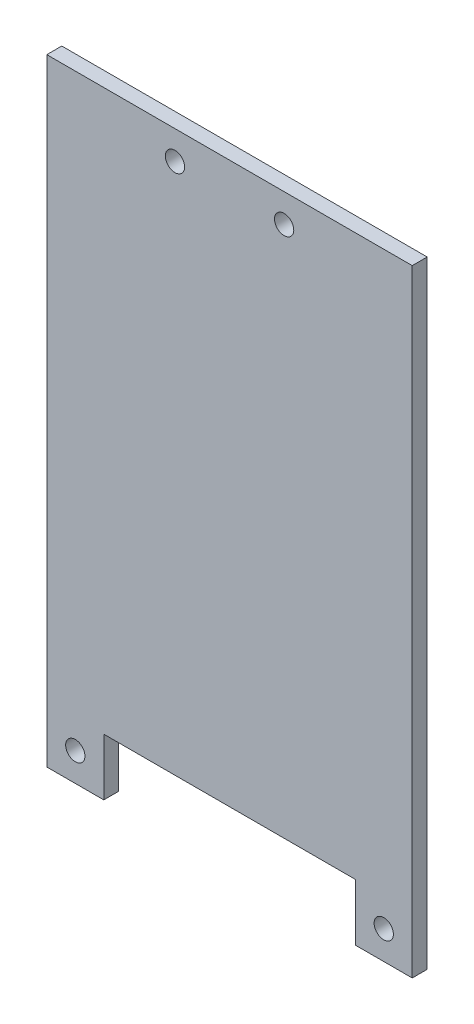
ISO-10303-21;
HEADER;
FILE_DESCRIPTION(('STEP AP214'),'2;1');
FILE_NAME('part.step','',(''),(''),'','','');
FILE_SCHEMA(('AUTOMOTIVE_DESIGN { 1 0 10303 214 1 1 1 1 }'));
ENDSEC;
DATA;
#1=APPLICATION_CONTEXT('core data for automotive mechanical design processes');
#2=APPLICATION_PROTOCOL_DEFINITION('international standard','automotive_design',2000,#1);
#3=PRODUCT_CONTEXT('',#1,'mechanical');
#4=PRODUCT('Part','Part','',(#3));
#5=PRODUCT_RELATED_PRODUCT_CATEGORY('part','',(#4));
#6=PRODUCT_DEFINITION_FORMATION('','',#4);
#7=PRODUCT_DEFINITION_CONTEXT('part definition',#1,'design');
#8=PRODUCT_DEFINITION('design','',#6,#7);
#9=PRODUCT_DEFINITION_SHAPE('','',#8);
#10=(LENGTH_UNIT() NAMED_UNIT(*) SI_UNIT(.MILLI.,.METRE.));
#11=(NAMED_UNIT(*) PLANE_ANGLE_UNIT() SI_UNIT($,.RADIAN.));
#12=(NAMED_UNIT(*) SI_UNIT($,.STERADIAN.) SOLID_ANGLE_UNIT());
#13=UNCERTAINTY_MEASURE_WITH_UNIT(LENGTH_MEASURE(1.E-05),#10,'distance_accuracy_value','');
#14=(GEOMETRIC_REPRESENTATION_CONTEXT(3) GLOBAL_UNCERTAINTY_ASSIGNED_CONTEXT((#13)) GLOBAL_UNIT_ASSIGNED_CONTEXT((#10,
#11,#12)) REPRESENTATION_CONTEXT('',''));
#15=CARTESIAN_POINT('',(0.,0.,0.));
#16=DIRECTION('',(0.,0.,1.));
#17=DIRECTION('',(1.,0.,0.));
#18=AXIS2_PLACEMENT_3D('',#15,#16,#17);
#19=CARTESIAN_POINT('',(6.10108,1.76276,1.5748));
#20=DIRECTION('',(0.,-1.,0.));
#21=DIRECTION('',(0.,0.,-1.));
#22=AXIS2_PLACEMENT_3D('',#19,#20,#21);
#23=PLANE('',#22);
#24=DIRECTION('',(-1.,0.,0.));
#25=VECTOR('',#24,1.);
#26=CARTESIAN_POINT('',(6.10108,1.76276,0.));
#27=LINE('',#26,#25);
#28=CARTESIAN_POINT('',(6.10108,1.76276,0.));
#29=VERTEX_POINT('',#28);
#30=CARTESIAN_POINT('',(0.1016,1.76276,0.));
#31=VERTEX_POINT('',#30);
#32=EDGE_CURVE('E142',#29,#31,#27,.T.);
#33=ORIENTED_EDGE('',*,*,#32,.F.);
#34=DIRECTION('',(0.,0.,-1.));
#35=VECTOR('',#34,1.);
#36=CARTESIAN_POINT('',(6.10108,1.76276,1.5748));
#37=LINE('',#36,#35);
#38=CARTESIAN_POINT('',(6.10108,1.76276,1.5748));
#39=VERTEX_POINT('',#38);
#40=EDGE_CURVE('E13',#39,#29,#37,.T.);
#41=ORIENTED_EDGE('',*,*,#40,.F.);
#42=DIRECTION('',(-1.,0.,0.));
#43=VECTOR('',#42,1.);
#44=CARTESIAN_POINT('',(6.10108,1.76276,1.5748));
#45=LINE('',#44,#43);
#46=CARTESIAN_POINT('',(0.1016,1.76276,1.5748));
#47=VERTEX_POINT('',#46);
#48=EDGE_CURVE('E163',#39,#47,#45,.T.);
#49=ORIENTED_EDGE('',*,*,#48,.T.);
#50=DIRECTION('',(0.,0.,-1.));
#51=VECTOR('',#50,1.);
#52=CARTESIAN_POINT('',(0.1016,1.76276,1.5748));
#53=LINE('',#52,#51);
#54=EDGE_CURVE('E49',#47,#31,#53,.T.);
#55=ORIENTED_EDGE('',*,*,#54,.T.);
#56=EDGE_LOOP('',(#33,#41,#49,#55));
#57=FACE_BOUND('',#56,.T.);
#58=ADVANCED_FACE('F46',(#57),#23,.T.);
#59=CARTESIAN_POINT('',(6.10108,7.76224,1.5748));
#60=DIRECTION('',(1.,0.,0.));
#61=DIRECTION('',(0.,0.,-1.));
#62=AXIS2_PLACEMENT_3D('',#59,#60,#61);
#63=PLANE('',#62);
#64=DIRECTION('',(0.,-1.,0.));
#65=VECTOR('',#64,1.);
#66=CARTESIAN_POINT('',(6.10108,7.76224,0.));
#67=LINE('',#66,#65);
#68=CARTESIAN_POINT('',(6.10108,7.76224,0.));
#69=VERTEX_POINT('',#68);
#70=EDGE_CURVE('E161',#69,#29,#67,.T.);
#71=ORIENTED_EDGE('',*,*,#70,.F.);
#72=DIRECTION('',(0.,0.,-1.));
#73=VECTOR('',#72,1.);
#74=CARTESIAN_POINT('',(6.10108,7.76224,1.5748));
#75=LINE('',#74,#73);
#76=CARTESIAN_POINT('',(6.10108,7.76224,1.5748));
#77=VERTEX_POINT('',#76);
#78=EDGE_CURVE('E55',#77,#69,#75,.T.);
#79=ORIENTED_EDGE('',*,*,#78,.F.);
#80=DIRECTION('',(0.,-1.,0.));
#81=VECTOR('',#80,1.);
#82=CARTESIAN_POINT('',(6.10108,7.76224,1.5748));
#83=LINE('',#82,#81);
#84=EDGE_CURVE('E122',#77,#39,#83,.T.);
#85=ORIENTED_EDGE('',*,*,#84,.T.);
#86=ORIENTED_EDGE('',*,*,#40,.T.);
#87=EDGE_LOOP('',(#71,#79,#85,#86));
#88=FACE_BOUND('',#87,.T.);
#89=ADVANCED_FACE('F176',(#88),#63,.T.);
#90=CARTESIAN_POINT('',(6.10108,7.76224,1.5748));
#91=DIRECTION('',(0.,1.,0.));
#92=DIRECTION('',(0.,0.,1.));
#93=AXIS2_PLACEMENT_3D('',#90,#91,#92);
#94=PLANE('',#93);
#95=DIRECTION('',(1.,0.,0.));
#96=VECTOR('',#95,1.);
#97=CARTESIAN_POINT('',(6.10108,7.76224,0.));
#98=LINE('',#97,#96);
#99=CARTESIAN_POINT('',(32.6009,7.76224,0.));
#100=VERTEX_POINT('',#99);
#101=EDGE_CURVE('E127',#69,#100,#98,.T.);
#102=ORIENTED_EDGE('',*,*,#101,.T.);
#103=DIRECTION('',(0.,0.,-1.));
#104=VECTOR('',#103,1.);
#105=CARTESIAN_POINT('',(32.6009,7.76224,1.5748));
#106=LINE('',#105,#104);
#107=CARTESIAN_POINT('',(32.6009,7.76224,1.5748));
#108=VERTEX_POINT('',#107);
#109=EDGE_CURVE('E125',#108,#100,#106,.T.);
#110=ORIENTED_EDGE('',*,*,#109,.F.);
#111=DIRECTION('',(1.,0.,0.));
#112=VECTOR('',#111,1.);
#113=CARTESIAN_POINT('',(6.10108,7.76224,1.5748));
#114=LINE('',#113,#112);
#115=EDGE_CURVE('E116',#77,#108,#114,.T.);
#116=ORIENTED_EDGE('',*,*,#115,.F.);
#117=ORIENTED_EDGE('',*,*,#78,.T.);
#118=EDGE_LOOP('',(#102,#110,#116,#117));
#119=FACE_BOUND('',#118,.T.);
#120=ADVANCED_FACE('F126',(#119),#94,.F.);
#121=CARTESIAN_POINT('',(32.6009,7.76224,1.5748));
#122=DIRECTION('',(1.,0.,0.));
#123=DIRECTION('',(0.,0.,-1.));
#124=AXIS2_PLACEMENT_3D('',#121,#122,#123);
#125=PLANE('',#124);
#126=DIRECTION('',(0.,-1.,0.));
#127=VECTOR('',#126,1.);
#128=CARTESIAN_POINT('',(32.6009,7.76224,0.));
#129=LINE('',#128,#127);
#130=CARTESIAN_POINT('',(32.6009,1.76276,0.));
#131=VERTEX_POINT('',#130);
#132=EDGE_CURVE('E158',#100,#131,#129,.T.);
#133=ORIENTED_EDGE('',*,*,#132,.T.);
#134=DIRECTION('',(0.,0.,-1.));
#135=VECTOR('',#134,1.);
#136=CARTESIAN_POINT('',(32.6009,1.76276,1.5748));
#137=LINE('',#136,#135);
#138=CARTESIAN_POINT('',(32.6009,1.76276,1.5748));
#139=VERTEX_POINT('',#138);
#140=EDGE_CURVE('E130',#139,#131,#137,.T.);
#141=ORIENTED_EDGE('',*,*,#140,.F.);
#142=DIRECTION('',(0.,-1.,0.));
#143=VECTOR('',#142,1.);
#144=CARTESIAN_POINT('',(32.6009,7.76224,1.5748));
#145=LINE('',#144,#143);
#146=EDGE_CURVE('E120',#108,#139,#145,.T.);
#147=ORIENTED_EDGE('',*,*,#146,.F.);
#148=ORIENTED_EDGE('',*,*,#109,.T.);
#149=EDGE_LOOP('',(#133,#141,#147,#148));
#150=FACE_BOUND('',#149,.T.);
#151=ADVANCED_FACE('F132',(#150),#125,.F.);
#152=CARTESIAN_POINT('',(32.6009,1.76276,1.5748));
#153=DIRECTION('',(0.,1.,0.));
#154=DIRECTION('',(0.,0.,1.));
#155=AXIS2_PLACEMENT_3D('',#152,#153,#154);
#156=PLANE('',#155);
#157=DIRECTION('',(1.,0.,0.));
#158=VECTOR('',#157,1.);
#159=CARTESIAN_POINT('',(32.6009,1.76276,0.));
#160=LINE('',#159,#158);
#161=CARTESIAN_POINT('',(38.60038,1.76276,0.));
#162=VERTEX_POINT('',#161);
#163=EDGE_CURVE('E155',#131,#162,#160,.T.);
#164=ORIENTED_EDGE('',*,*,#163,.T.);
#165=DIRECTION('',(0.,0.,-1.));
#166=VECTOR('',#165,1.);
#167=CARTESIAN_POINT('',(38.60038,1.76276,1.5748));
#168=LINE('',#167,#166);
#169=CARTESIAN_POINT('',(38.60038,1.76276,1.5748));
#170=VERTEX_POINT('',#169);
#171=EDGE_CURVE('E167',#170,#162,#168,.T.);
#172=ORIENTED_EDGE('',*,*,#171,.F.);
#173=DIRECTION('',(1.,0.,0.));
#174=VECTOR('',#173,1.);
#175=CARTESIAN_POINT('',(32.6009,1.76276,1.5748));
#176=LINE('',#175,#174);
#177=EDGE_CURVE('E135',#139,#170,#176,.T.);
#178=ORIENTED_EDGE('',*,*,#177,.F.);
#179=ORIENTED_EDGE('',*,*,#140,.T.);
#180=EDGE_LOOP('',(#164,#172,#178,#179));
#181=FACE_BOUND('',#180,.T.);
#182=ADVANCED_FACE('F189',(#181),#156,.F.);
#183=CARTESIAN_POINT('',(38.60038,66.76136,1.5748));
#184=DIRECTION('',(1.,0.,0.));
#185=DIRECTION('',(0.,0.,-1.));
#186=AXIS2_PLACEMENT_3D('',#183,#184,#185);
#187=PLANE('',#186);
#188=DIRECTION('',(0.,-1.,0.));
#189=VECTOR('',#188,1.);
#190=CARTESIAN_POINT('',(38.60038,66.76136,0.));
#191=LINE('',#190,#189);
#192=CARTESIAN_POINT('',(38.60038,66.76136,0.));
#193=VERTEX_POINT('',#192);
#194=EDGE_CURVE('E152',#193,#162,#191,.T.);
#195=ORIENTED_EDGE('',*,*,#194,.F.);
#196=DIRECTION('',(0.,0.,-1.));
#197=VECTOR('',#196,1.);
#198=CARTESIAN_POINT('',(38.60038,66.76136,1.5748));
#199=LINE('',#198,#197);
#200=CARTESIAN_POINT('',(38.60038,66.76136,1.5748));
#201=VERTEX_POINT('',#200);
#202=EDGE_CURVE('E169',#201,#193,#199,.T.);
#203=ORIENTED_EDGE('',*,*,#202,.F.);
#204=DIRECTION('',(0.,-1.,0.));
#205=VECTOR('',#204,1.);
#206=CARTESIAN_POINT('',(38.60038,66.76136,1.5748));
#207=LINE('',#206,#205);
#208=EDGE_CURVE('E137',#201,#170,#207,.T.);
#209=ORIENTED_EDGE('',*,*,#208,.T.);
#210=ORIENTED_EDGE('',*,*,#171,.T.);
#211=EDGE_LOOP('',(#195,#203,#209,#210));
#212=FACE_BOUND('',#211,.T.);
#213=ADVANCED_FACE('F192',(#212),#187,.T.);
#214=CARTESIAN_POINT('',(38.60038,66.76136,1.5748));
#215=DIRECTION('',(0.,-1.,0.));
#216=DIRECTION('',(0.,0.,-1.));
#217=AXIS2_PLACEMENT_3D('',#214,#215,#216);
#218=PLANE('',#217);
#219=DIRECTION('',(-1.,0.,0.));
#220=VECTOR('',#219,1.);
#221=CARTESIAN_POINT('',(38.60038,66.76136,0.));
#222=LINE('',#221,#220);
#223=CARTESIAN_POINT('',(0.1016,66.76136,0.));
#224=VERTEX_POINT('',#223);
#225=EDGE_CURVE('E149',#193,#224,#222,.T.);
#226=ORIENTED_EDGE('',*,*,#225,.T.);
#227=DIRECTION('',(0.,0.,-1.));
#228=VECTOR('',#227,1.);
#229=CARTESIAN_POINT('',(0.1016,66.76136,1.5748));
#230=LINE('',#229,#228);
#231=CARTESIAN_POINT('',(0.1016,66.76136,1.5748));
#232=VERTEX_POINT('',#231);
#233=EDGE_CURVE('E170',#232,#224,#230,.T.);
#234=ORIENTED_EDGE('',*,*,#233,.F.);
#235=DIRECTION('',(-1.,0.,0.));
#236=VECTOR('',#235,1.);
#237=CARTESIAN_POINT('',(38.60038,66.76136,1.5748));
#238=LINE('',#237,#236);
#239=EDGE_CURVE('E258',#201,#232,#238,.T.);
#240=ORIENTED_EDGE('',*,*,#239,.F.);
#241=ORIENTED_EDGE('',*,*,#202,.T.);
#242=EDGE_LOOP('',(#226,#234,#240,#241));
#243=FACE_BOUND('',#242,.T.);
#244=ADVANCED_FACE('F196',(#243),#218,.F.);
#245=CARTESIAN_POINT('',(0.1016,1.76276,1.5748));
#246=DIRECTION('',(-1.,0.,0.));
#247=DIRECTION('',(0.,0.,1.));
#248=AXIS2_PLACEMENT_3D('',#245,#246,#247);
#249=PLANE('',#248);
#250=DIRECTION('',(0.,1.,0.));
#251=VECTOR('',#250,1.);
#252=CARTESIAN_POINT('',(0.1016,1.76276,0.));
#253=LINE('',#252,#251);
#254=EDGE_CURVE('E145',#31,#224,#253,.T.);
#255=ORIENTED_EDGE('',*,*,#254,.F.);
#256=ORIENTED_EDGE('',*,*,#54,.F.);
#257=DIRECTION('',(0.,1.,0.));
#258=VECTOR('',#257,1.);
#259=CARTESIAN_POINT('',(0.1016,1.76276,1.5748));
#260=LINE('',#259,#258);
#261=EDGE_CURVE('E256',#47,#232,#260,.T.);
#262=ORIENTED_EDGE('',*,*,#261,.T.);
#263=ORIENTED_EDGE('',*,*,#233,.T.);
#264=EDGE_LOOP('',(#255,#256,#262,#263));
#265=FACE_BOUND('',#264,.T.);
#266=ADVANCED_FACE('F172',(#265),#249,.T.);
#267=CARTESIAN_POINT('',(0.,0.,1.5748));
#268=DIRECTION('',(0.,0.,-1.));
#269=DIRECTION('',(-1.,0.,0.));
#270=AXIS2_PLACEMENT_3D('',#267,#268,#269);
#271=PLANE('',#270);
#272=CARTESIAN_POINT('',(35.60064,4.7625,1.5748));
#273=DIRECTION('',(0.,0.,1.));
#274=DIRECTION('',(1.,0.,0.));
#275=AXIS2_PLACEMENT_3D('',#272,#273,#274);
#276=CIRCLE('',#275,1.016);
#277=CARTESIAN_POINT('',(36.61664,4.7625,1.5748));
#278=VERTEX_POINT('',#277);
#279=EDGE_CURVE('E234',#278,#278,#276,.T.);
#280=ORIENTED_EDGE('',*,*,#279,.F.);
#281=EDGE_LOOP('',(#280));
#282=FACE_BOUND('',#281,.T.);
#283=CARTESIAN_POINT('',(3.10134,4.7625,1.5748));
#284=DIRECTION('',(0.,0.,1.));
#285=DIRECTION('',(1.,0.,0.));
#286=AXIS2_PLACEMENT_3D('',#283,#284,#285);
#287=CIRCLE('',#286,1.016);
#288=CARTESIAN_POINT('',(4.11734,4.7625,1.5748));
#289=VERTEX_POINT('',#288);
#290=EDGE_CURVE('E236',#289,#289,#287,.T.);
#291=ORIENTED_EDGE('',*,*,#290,.F.);
#292=EDGE_LOOP('',(#291));
#293=FACE_BOUND('',#292,.T.);
#294=CARTESIAN_POINT('',(25.10282,63.76162,1.5748));
#295=DIRECTION('',(0.,0.,1.));
#296=DIRECTION('',(1.,0.,0.));
#297=AXIS2_PLACEMENT_3D('',#294,#295,#296);
#298=CIRCLE('',#297,1.016);
#299=CARTESIAN_POINT('',(26.11882,63.76162,1.5748));
#300=VERTEX_POINT('',#299);
#301=EDGE_CURVE('E242',#300,#300,#298,.T.);
#302=ORIENTED_EDGE('',*,*,#301,.F.);
#303=EDGE_LOOP('',(#302));
#304=FACE_BOUND('',#303,.T.);
#305=CARTESIAN_POINT('',(13.6017,63.76162,1.5748));
#306=DIRECTION('',(0.,0.,1.));
#307=DIRECTION('',(1.,0.,0.));
#308=AXIS2_PLACEMENT_3D('',#305,#306,#307);
#309=CIRCLE('',#308,1.016);
#310=CARTESIAN_POINT('',(14.6177,63.76162,1.5748));
#311=VERTEX_POINT('',#310);
#312=EDGE_CURVE('E248',#311,#311,#309,.T.);
#313=ORIENTED_EDGE('',*,*,#312,.F.);
#314=EDGE_LOOP('',(#313));
#315=FACE_BOUND('',#314,.T.);
#316=ORIENTED_EDGE('',*,*,#48,.F.);
#317=ORIENTED_EDGE('',*,*,#84,.F.);
#318=ORIENTED_EDGE('',*,*,#115,.T.);
#319=ORIENTED_EDGE('',*,*,#146,.T.);
#320=ORIENTED_EDGE('',*,*,#177,.T.);
#321=ORIENTED_EDGE('',*,*,#208,.F.);
#322=ORIENTED_EDGE('',*,*,#239,.T.);
#323=ORIENTED_EDGE('',*,*,#261,.F.);
#324=EDGE_LOOP('',(#316,#317,#318,#319,#320,#321,#322,#323));
#325=FACE_BOUND('',#324,.T.);
#326=ADVANCED_FACE('F118',(#282,#293,#304,#315,#325),#271,.F.);
#327=CARTESIAN_POINT('',(0.,0.,0.));
#328=DIRECTION('',(0.,0.,-1.));
#329=DIRECTION('',(-1.,0.,0.));
#330=AXIS2_PLACEMENT_3D('',#327,#328,#329);
#331=PLANE('',#330);
#332=CARTESIAN_POINT('',(35.60064,4.7625,0.));
#333=DIRECTION('',(0.,0.,1.));
#334=DIRECTION('',(1.,0.,0.));
#335=AXIS2_PLACEMENT_3D('',#332,#333,#334);
#336=CIRCLE('',#335,1.016);
#337=CARTESIAN_POINT('',(36.61664,4.7625,0.));
#338=VERTEX_POINT('',#337);
#339=EDGE_CURVE('E232',#338,#338,#336,.T.);
#340=ORIENTED_EDGE('',*,*,#339,.T.);
#341=EDGE_LOOP('',(#340));
#342=FACE_BOUND('',#341,.T.);
#343=CARTESIAN_POINT('',(3.10134,4.7625,0.));
#344=DIRECTION('',(0.,0.,1.));
#345=DIRECTION('',(1.,0.,0.));
#346=AXIS2_PLACEMENT_3D('',#343,#344,#345);
#347=CIRCLE('',#346,1.016);
#348=CARTESIAN_POINT('',(4.11734,4.7625,0.));
#349=VERTEX_POINT('',#348);
#350=EDGE_CURVE('E239',#349,#349,#347,.T.);
#351=ORIENTED_EDGE('',*,*,#350,.T.);
#352=EDGE_LOOP('',(#351));
#353=FACE_BOUND('',#352,.T.);
#354=CARTESIAN_POINT('',(25.10282,63.76162,0.));
#355=DIRECTION('',(0.,0.,1.));
#356=DIRECTION('',(1.,0.,0.));
#357=AXIS2_PLACEMENT_3D('',#354,#355,#356);
#358=CIRCLE('',#357,1.016);
#359=CARTESIAN_POINT('',(26.11882,63.76162,0.));
#360=VERTEX_POINT('',#359);
#361=EDGE_CURVE('E245',#360,#360,#358,.T.);
#362=ORIENTED_EDGE('',*,*,#361,.T.);
#363=EDGE_LOOP('',(#362));
#364=FACE_BOUND('',#363,.T.);
#365=CARTESIAN_POINT('',(13.6017,63.76162,0.));
#366=DIRECTION('',(0.,0.,1.));
#367=DIRECTION('',(1.,0.,0.));
#368=AXIS2_PLACEMENT_3D('',#365,#366,#367);
#369=CIRCLE('',#368,1.016);
#370=CARTESIAN_POINT('',(14.6177,63.76162,0.));
#371=VERTEX_POINT('',#370);
#372=EDGE_CURVE('E146',#371,#371,#369,.T.);
#373=ORIENTED_EDGE('',*,*,#372,.T.);
#374=EDGE_LOOP('',(#373));
#375=FACE_BOUND('',#374,.T.);
#376=ORIENTED_EDGE('',*,*,#32,.T.);
#377=ORIENTED_EDGE('',*,*,#254,.T.);
#378=ORIENTED_EDGE('',*,*,#225,.F.);
#379=ORIENTED_EDGE('',*,*,#194,.T.);
#380=ORIENTED_EDGE('',*,*,#163,.F.);
#381=ORIENTED_EDGE('',*,*,#132,.F.);
#382=ORIENTED_EDGE('',*,*,#101,.F.);
#383=ORIENTED_EDGE('',*,*,#70,.T.);
#384=EDGE_LOOP('',(#376,#377,#378,#379,#380,#381,#382,#383));
#385=FACE_BOUND('',#384,.T.);
#386=ADVANCED_FACE('F175',(#342,#353,#364,#375,#385),#331,.T.);
#387=CARTESIAN_POINT('',(13.6017,63.76162,0.));
#388=DIRECTION('',(0.,0.,1.));
#389=DIRECTION('',(1.,0.,0.));
#390=AXIS2_PLACEMENT_3D('',#387,#388,#389);
#391=CYLINDRICAL_SURFACE('',#390,1.016);
#392=ORIENTED_EDGE('',*,*,#372,.F.);
#393=EDGE_LOOP('',(#392));
#394=FACE_BOUND('',#393,.T.);
#395=ORIENTED_EDGE('',*,*,#312,.T.);
#396=EDGE_LOOP('',(#395));
#397=FACE_BOUND('',#396,.T.);
#398=ADVANCED_FACE('F208',(#394,#397),#391,.F.);
#399=CARTESIAN_POINT('',(25.10282,63.76162,0.));
#400=DIRECTION('',(0.,0.,1.));
#401=DIRECTION('',(1.,0.,0.));
#402=AXIS2_PLACEMENT_3D('',#399,#400,#401);
#403=CYLINDRICAL_SURFACE('',#402,1.016);
#404=ORIENTED_EDGE('',*,*,#361,.F.);
#405=EDGE_LOOP('',(#404));
#406=FACE_BOUND('',#405,.T.);
#407=ORIENTED_EDGE('',*,*,#301,.T.);
#408=EDGE_LOOP('',(#407));
#409=FACE_BOUND('',#408,.T.);
#410=ADVANCED_FACE('F215',(#406,#409),#403,.F.);
#411=CARTESIAN_POINT('',(3.10134,4.7625,0.));
#412=DIRECTION('',(0.,0.,1.));
#413=DIRECTION('',(1.,0.,0.));
#414=AXIS2_PLACEMENT_3D('',#411,#412,#413);
#415=CYLINDRICAL_SURFACE('',#414,1.016);
#416=ORIENTED_EDGE('',*,*,#350,.F.);
#417=EDGE_LOOP('',(#416));
#418=FACE_BOUND('',#417,.T.);
#419=ORIENTED_EDGE('',*,*,#290,.T.);
#420=EDGE_LOOP('',(#419));
#421=FACE_BOUND('',#420,.T.);
#422=ADVANCED_FACE('F219',(#418,#421),#415,.F.);
#423=CARTESIAN_POINT('',(35.60064,4.7625,0.));
#424=DIRECTION('',(0.,0.,1.));
#425=DIRECTION('',(1.,0.,0.));
#426=AXIS2_PLACEMENT_3D('',#423,#424,#425);
#427=CYLINDRICAL_SURFACE('',#426,1.016);
#428=ORIENTED_EDGE('',*,*,#339,.F.);
#429=EDGE_LOOP('',(#428));
#430=FACE_BOUND('',#429,.T.);
#431=ORIENTED_EDGE('',*,*,#279,.T.);
#432=EDGE_LOOP('',(#431));
#433=FACE_BOUND('',#432,.T.);
#434=ADVANCED_FACE('F223',(#430,#433),#427,.F.);
#435=CLOSED_SHELL('',(#58,#89,#120,#151,#182,#213,#244,#266,#326,#386,#398,#410,#422,#434));
#436=MANIFOLD_SOLID_BREP('B2',#435);
#437=ADVANCED_BREP_SHAPE_REPRESENTATION('',(#18,#436),#14);
#438=SHAPE_DEFINITION_REPRESENTATION(#9,#437);
ENDSEC;
END-ISO-10303-21;
